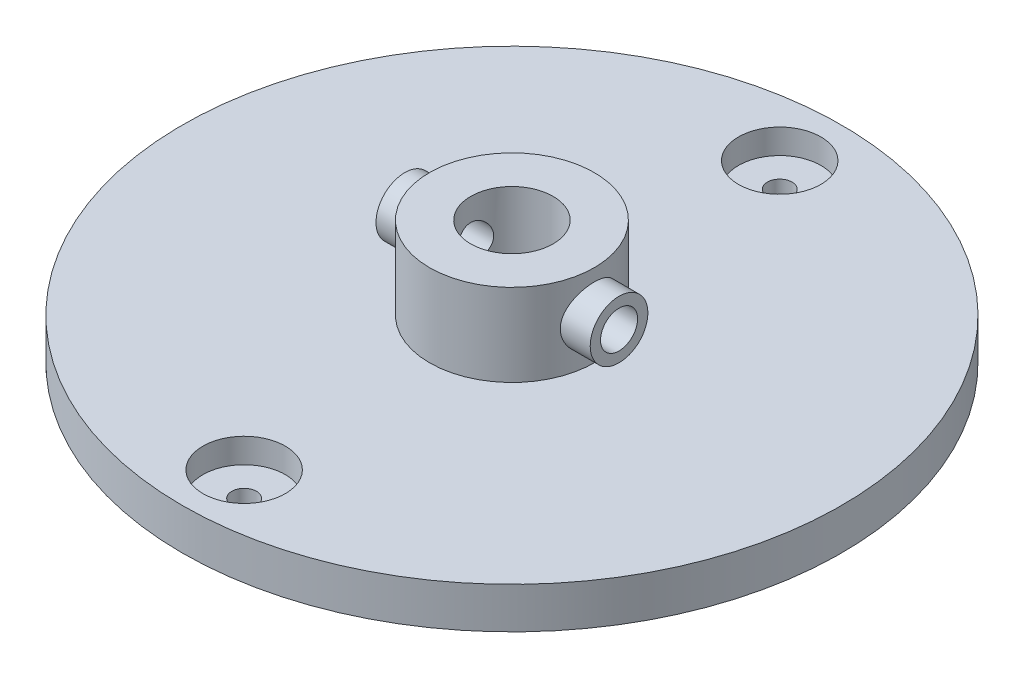
ISO-10303-21;
HEADER;
FILE_DESCRIPTION(('STEP AP214'),'2;1');
FILE_NAME('part.step','',(''),(''),'','','');
FILE_SCHEMA(('AUTOMOTIVE_DESIGN { 1 0 10303 214 1 1 1 1 }'));
ENDSEC;
DATA;
#1=APPLICATION_CONTEXT('core data for automotive mechanical design processes');
#2=APPLICATION_PROTOCOL_DEFINITION('international standard','automotive_design',2000,#1);
#3=PRODUCT_CONTEXT('',#1,'mechanical');
#4=PRODUCT('Part','Part','',(#3));
#5=PRODUCT_RELATED_PRODUCT_CATEGORY('part','',(#4));
#6=PRODUCT_DEFINITION_FORMATION('','',#4);
#7=PRODUCT_DEFINITION_CONTEXT('part definition',#1,'design');
#8=PRODUCT_DEFINITION('design','',#6,#7);
#9=PRODUCT_DEFINITION_SHAPE('','',#8);
#10=(LENGTH_UNIT() NAMED_UNIT(*) SI_UNIT(.MILLI.,.METRE.));
#11=(NAMED_UNIT(*) PLANE_ANGLE_UNIT() SI_UNIT($,.RADIAN.));
#12=(NAMED_UNIT(*) SI_UNIT($,.STERADIAN.) SOLID_ANGLE_UNIT());
#13=UNCERTAINTY_MEASURE_WITH_UNIT(LENGTH_MEASURE(1.E-05),#10,'distance_accuracy_value','');
#14=(GEOMETRIC_REPRESENTATION_CONTEXT(3) GLOBAL_UNCERTAINTY_ASSIGNED_CONTEXT((#13)) GLOBAL_UNIT_ASSIGNED_CONTEXT((#10,
#11,#12)) REPRESENTATION_CONTEXT('',''));
#15=CARTESIAN_POINT('',(0.,0.,0.));
#16=DIRECTION('',(0.,0.,1.));
#17=DIRECTION('',(1.,0.,0.));
#18=AXIS2_PLACEMENT_3D('',#15,#16,#17);
#19=CARTESIAN_POINT('',(4.14762753306674,15.,5.46076691114872));
#20=DIRECTION('',(0.,-1.,0.));
#21=DIRECTION('',(0.,0.,-1.));
#22=AXIS2_PLACEMENT_3D('',#19,#20,#21);
#23=CYLINDRICAL_SURFACE('',#22,10.);
#24=CARTESIAN_POINT('',(-5.21986946453087,9.99999999999999,1.96076691114871));
#25=CARTESIAN_POINT('',(-5.21986687665246,10.1900152284432,1.9607638546146));
#26=CARTESIAN_POINT('',(-5.22571408078831,10.3800091662818,1.97629285423085));
#27=CARTESIAN_POINT('',(-5.24833354619784,10.754329226878,2.03776122428684));
#28=CARTESIAN_POINT('',(-5.26510671521073,10.9386548773765,2.0837031214632));
#29=CARTESIAN_POINT('',(-5.30745044309769,11.2961466836094,2.20415434011447));
#30=CARTESIAN_POINT('',(-5.33300229725591,11.4693356443051,2.27860296071652));
#31=CARTESIAN_POINT('',(-5.38999603122424,11.8008267674047,2.4537436926653));
#32=CARTESIAN_POINT('',(-5.42143940799503,11.9591251309098,2.55444247639322));
#33=CARTESIAN_POINT('',(-5.48819589185516,12.2631786167826,2.78388397149806));
#34=CARTESIAN_POINT('',(-5.52361242878601,12.4081978438373,2.91357203596137));
#35=CARTESIAN_POINT('',(-5.593455005276,12.6749374940333,3.19529774863712));
#36=CARTESIAN_POINT('',(-5.62788086578551,12.7966537277083,3.34733940696044));
#37=CARTESIAN_POINT('',(-5.69307302407926,13.0167501289199,3.67491672509639));
#38=CARTESIAN_POINT('',(-5.72370366593817,13.1143480900762,3.85100733707501));
#39=CARTESIAN_POINT('',(-5.77662606937584,13.2782396177485,4.21836547693517));
#40=CARTESIAN_POINT('',(-5.79892032443189,13.3445425464079,4.40962844586724));
#41=CARTESIAN_POINT('',(-5.83192481088995,13.4414335774764,4.79417802889245));
#42=CARTESIAN_POINT('',(-5.84304357203917,13.4732847450521,4.98711067304786));
#43=CARTESIAN_POINT('',(-5.85390061643987,13.5043961753192,5.37588130900486));
#44=CARTESIAN_POINT('',(-5.85364212746184,13.5036656815551,5.57171846102468));
#45=CARTESIAN_POINT('',(-5.84204411383341,13.4704103836545,5.9517554525186));
#46=CARTESIAN_POINT('',(-5.83118360247201,13.4392599696618,6.1360926255396));
#47=CARTESIAN_POINT('',(-5.80021364050776,13.3483369720774,6.49673537307453));
#48=CARTESIAN_POINT('',(-5.78010354893129,13.288562404889,6.67304039004868));
#49=CARTESIAN_POINT('',(-5.73231116387176,13.1413506967889,7.01548174296641));
#50=CARTESIAN_POINT('',(-5.7045283527223,13.0535437479981,7.1814444946287));
#51=CARTESIAN_POINT('',(-5.64425170797549,12.853072546675,7.496668085162));
#52=CARTESIAN_POINT('',(-5.61175647605714,12.7404009108251,7.6459239432066));
#53=CARTESIAN_POINT('',(-5.54347369962726,12.486587853106,7.93164683021429));
#54=CARTESIAN_POINT('',(-5.50760279022323,12.3442779649731,8.06705752288942));
#55=CARTESIAN_POINT('',(-5.43799609904677,12.0386960162178,8.31245569500653));
#56=CARTESIAN_POINT('',(-5.40426072121509,11.8754200073885,8.42243837505396));
#57=CARTESIAN_POINT('',(-5.34226069951454,11.5288799309362,8.6155284432016));
#58=CARTESIAN_POINT('',(-5.31409966938872,11.3453213771916,8.6981431805713));
#59=CARTESIAN_POINT('',(-5.26763201015099,10.9656586516986,8.83091448548673));
#60=CARTESIAN_POINT('',(-5.24932073796607,10.7695604398775,8.88108634852309));
#61=CARTESIAN_POINT('',(-5.22569352663041,10.3807032503863,8.94530021736018));
#62=CARTESIAN_POINT('',(-5.21978328859801,10.188253602383,8.96099628383413));
#63=CARTESIAN_POINT('',(-5.21995749005509,9.8034208395003,8.96053258790133));
#64=CARTESIAN_POINT('',(-5.22603945405916,9.61103771908709,8.94437939996394));
#65=CARTESIAN_POINT('',(-5.24891582224021,9.23968188163594,8.88216775068631));
#66=CARTESIAN_POINT('',(-5.26528073475515,9.06047913307321,8.83730700562205));
#67=CARTESIAN_POINT('',(-5.3063921933865,8.71219693104326,8.72041759834967));
#68=CARTESIAN_POINT('',(-5.33114031837163,8.54311939159119,8.64838381816424));
#69=CARTESIAN_POINT('',(-5.38727198369573,8.21349055582935,8.47641206598258));
#70=CARTESIAN_POINT('',(-5.41885298032786,8.05342647162964,8.37560648065644));
#71=CARTESIAN_POINT('',(-5.4847293365715,7.75189155143616,8.14991191747914));
#72=CARTESIAN_POINT('',(-5.51902557163154,7.61042675166998,8.02501515334125));
#73=CARTESIAN_POINT('',(-5.58870365719288,7.34221271457581,7.74669938563421));
#74=CARTESIAN_POINT('',(-5.62404436923233,7.21666780735564,7.59210579607881));
#75=CARTESIAN_POINT('',(-5.69002619521553,6.99319819734154,7.26317284727119));
#76=CARTESIAN_POINT('',(-5.7206674183363,6.89527285285453,7.08883394689926));
#77=CARTESIAN_POINT('',(-5.77369382929774,6.73064573911158,6.72598307458043));
#78=CARTESIAN_POINT('',(-5.79612478880901,6.66377028967395,6.5375569565149));
#79=CARTESIAN_POINT('',(-5.83039183520593,6.56297441903225,6.15118166121807));
#80=CARTESIAN_POINT('',(-5.84223218608898,6.52904073432456,5.95323635046693));
#81=CARTESIAN_POINT('',(-5.85362976427073,6.49637958739644,5.56440379490104));
#82=CARTESIAN_POINT('',(-5.85378751777275,6.49593087152782,5.373677276388));
#83=CARTESIAN_POINT('',(-5.84331447113532,6.52593609624751,4.99499183721998));
#84=CARTESIAN_POINT('',(-5.83268470234666,6.55638708264191,4.80703265373424));
#85=CARTESIAN_POINT('',(-5.80207369861303,6.64615469186611,4.44280327173886));
#86=CARTESIAN_POINT('',(-5.78227394474207,6.70491197983297,4.26637885168844));
#87=CARTESIAN_POINT('',(-5.73536718200365,6.84909270984445,3.92584288400897));
#88=CARTESIAN_POINT('',(-5.70825881475543,6.93452110945554,3.76173363253587));
#89=CARTESIAN_POINT('',(-5.64817568389101,7.13345438296181,3.44346632482008));
#90=CARTESIAN_POINT('',(-5.61501273601348,7.24792788099003,3.28994978441793));
#91=CARTESIAN_POINT('',(-5.54694636514274,7.50010266562639,3.00375335006897));
#92=CARTESIAN_POINT('',(-5.51204236166445,7.63781173615961,2.87108046761279));
#93=CARTESIAN_POINT('',(-5.44256368283997,7.93983709021465,2.62432394062248));
#94=CARTESIAN_POINT('',(-5.40807229654529,8.1050626660869,2.51132595086188));
#95=CARTESIAN_POINT('',(-5.34516936083942,8.45324771431642,2.31473639116619));
#96=CARTESIAN_POINT('',(-5.31675702476101,8.63620488763618,2.23114101544587));
#97=CARTESIAN_POINT('',(-5.2699145074793,9.01280429693809,2.0969985700102));
#98=CARTESIAN_POINT('',(-5.2513771772574,9.20630562654927,2.04609547161435));
#99=CARTESIAN_POINT('',(-5.22635872503917,9.59988116532614,1.97798881784396));
#100=CARTESIAN_POINT('',(-5.21987218904363,9.79995238173779,1.96077012906117));
#101=CARTESIAN_POINT('',(-5.21986946453087,9.99999999999999,1.96076691114871));
#102=B_SPLINE_CURVE_WITH_KNOTS('',3,(#24,#25,#26,#27,#28,#29,#30,#31,#32,#33,#34,#35,#36,#37,
#38,#39,#40,#41,#42,#43,#44,#45,#46,#47,#48,#49,#50,#51,#52,#53,#54,#55,#56,#57,#58,#59,#60,#61,
#62,#63,#64,#65,#66,#67,#68,#69,#70,#71,#72,#73,#74,#75,#76,#77,#78,#79,#80,#81,#82,#83,#84,#85,
#86,#87,#88,#89,#90,#91,#92,#93,#94,#95,#96,#97,#98,#99,#100,#101),.UNSPECIFIED.,.T.,.F.,(4,2,2,
2,2,2,2,2,2,2,2,2,2,2,2,2,2,2,2,2,2,2,2,2,2,2,2,2,2,2,2,2,2,2,2,2,2,2,4),(0.,0.569303271188397,
1.1386538466494,1.7067987558077,2.27508821957678,2.86567632067937,3.45637049958397,
4.06425497293885,4.671957477662,5.25653473089017,5.84094613832784,6.4001199130392,
6.95933244298444,7.52625023609969,8.09333659677847,8.68966509904168,9.28610606324157,
9.89276413906806,10.499135991446,11.0757147838072,11.6521745685868,12.2060258875446,
12.7599815752237,13.3328233448281,13.9058505684788,14.5097673315547,15.1136700625062,
15.7141528622371,16.3143937862434,16.8837576246019,17.4530670335451,18.0115615554683,
18.5701599509704,19.1506370908609,19.7313090782975,20.3377389331388,20.9440902646265,
21.5437209656749,22.1430822084723),.UNSPECIFIED.);
#103=CARTESIAN_POINT('',(-5.21986946453087,9.99999999999999,1.96076691114871));
#104=VERTEX_POINT('',#103);
#105=EDGE_CURVE('E145',#104,#104,#102,.T.);
#106=ORIENTED_EDGE('',*,*,#105,.T.);
#107=EDGE_LOOP('',(#106));
#108=FACE_BOUND('',#107,.T.);
#109=CARTESIAN_POINT('',(4.14762753306673,5.,5.46076691114872));
#110=DIRECTION('',(0.,1.,0.));
#111=DIRECTION('',(0.,0.,1.));
#112=AXIS2_PLACEMENT_3D('',#109,#110,#111);
#113=CIRCLE('',#112,10.);
#114=CARTESIAN_POINT('',(4.14762753306673,5.,15.4607669111487));
#115=VERTEX_POINT('',#114);
#116=EDGE_CURVE('E98',#115,#115,#113,.T.);
#117=ORIENTED_EDGE('',*,*,#116,.T.);
#118=EDGE_LOOP('',(#117));
#119=FACE_BOUND('',#118,.T.);
#120=CARTESIAN_POINT('',(4.14762753306674,15.,5.46076691114872));
#121=DIRECTION('',(0.,1.,0.));
#122=DIRECTION('',(0.,0.,1.));
#123=AXIS2_PLACEMENT_3D('',#120,#121,#122);
#124=CIRCLE('',#123,10.);
#125=CARTESIAN_POINT('',(4.14762753306674,15.,15.4607669111487));
#126=VERTEX_POINT('',#125);
#127=EDGE_CURVE('E95',#126,#126,#124,.T.);
#128=ORIENTED_EDGE('',*,*,#127,.F.);
#129=EDGE_LOOP('',(#128));
#130=FACE_BOUND('',#129,.T.);
#131=CARTESIAN_POINT('',(13.5151245306643,9.99999999999999,8.96076691114871));
#132=CARTESIAN_POINT('',(13.5151219427859,9.80998477155683,8.96076996768283));
#133=CARTESIAN_POINT('',(13.5209691469218,9.61999083371819,8.94524096806651));
#134=CARTESIAN_POINT('',(13.5435886123314,9.24567077312197,8.88377259801048));
#135=CARTESIAN_POINT('',(13.5603617813442,9.06134512262348,8.83783070083414));
#136=CARTESIAN_POINT('',(13.6027055092311,8.70385331639056,8.71737948218289));
#137=CARTESIAN_POINT('',(13.6282573633894,8.53066435569495,8.64293086158082));
#138=CARTESIAN_POINT('',(13.6852510973577,8.1991732325953,8.46779012963206));
#139=CARTESIAN_POINT('',(13.7166944741285,8.04087486909023,8.36709134590415));
#140=CARTESIAN_POINT('',(13.7834509579886,7.73682138321736,8.13764985079932));
#141=CARTESIAN_POINT('',(13.8188674949195,7.59180215616272,8.00796178633599));
#142=CARTESIAN_POINT('',(13.8887100714095,7.32506250596673,7.72623607366023));
#143=CARTESIAN_POINT('',(13.923135931919,7.20334627229171,7.57419441533691));
#144=CARTESIAN_POINT('',(13.9883280902127,6.98324987108005,7.24661709720097));
#145=CARTESIAN_POINT('',(14.0189587320717,6.88565190992379,7.07052648522235));
#146=CARTESIAN_POINT('',(14.0718811355093,6.72176038225146,6.70316834536218));
#147=CARTESIAN_POINT('',(14.0941753905653,6.65545745359213,6.51190537643011));
#148=CARTESIAN_POINT('',(14.1271798770234,6.55856642252359,6.1273557934049));
#149=CARTESIAN_POINT('',(14.1382986381726,6.52671525494792,5.93442314924949));
#150=CARTESIAN_POINT('',(14.1491556825733,6.49560382468076,5.5456525132925));
#151=CARTESIAN_POINT('',(14.1488971935953,6.49633431844493,5.34981536127268));
#152=CARTESIAN_POINT('',(14.1372991799668,6.52958961634551,4.96977836977875));
#153=CARTESIAN_POINT('',(14.1264386686055,6.56074003033821,4.78544119675776));
#154=CARTESIAN_POINT('',(14.0954687066412,6.65166302792263,4.42479844922285));
#155=CARTESIAN_POINT('',(14.0753586150647,6.71143759511096,4.24849343224871));
#156=CARTESIAN_POINT('',(14.0275662300052,6.85864930321107,3.90605207933097));
#157=CARTESIAN_POINT('',(13.9997834188558,6.94645625200186,3.74008932766867));
#158=CARTESIAN_POINT('',(13.9395067741089,7.14692745332499,3.42486573713538));
#159=CARTESIAN_POINT('',(13.9070115421906,7.25959908917485,3.2756098790908));
#160=CARTESIAN_POINT('',(13.8387287657607,7.51341214689405,2.9898869920831));
#161=CARTESIAN_POINT('',(13.8028578563567,7.65572203502689,2.85447629940793));
#162=CARTESIAN_POINT('',(13.7332511651802,7.9613039837822,2.6090781272908));
#163=CARTESIAN_POINT('',(13.6995157873485,8.12457999261145,2.49909544724338));
#164=CARTESIAN_POINT('',(13.637515765648,8.47112006906378,2.30600537909574));
#165=CARTESIAN_POINT('',(13.6093547355222,8.65467862280837,2.22339064172603));
#166=CARTESIAN_POINT('',(13.5628870762844,9.03434134830137,2.09061933681062));
#167=CARTESIAN_POINT('',(13.5445758040995,9.23043956012249,2.04044747377431));
#168=CARTESIAN_POINT('',(13.5209485927639,9.61929674961367,1.97623360493721));
#169=CARTESIAN_POINT('',(13.5150383547314,9.81174639761701,1.96053753846322));
#170=CARTESIAN_POINT('',(13.5152125561885,10.1965791604997,1.961001234396));
#171=CARTESIAN_POINT('',(13.5212945201926,10.3889622809129,1.97715442233342));
#172=CARTESIAN_POINT('',(13.5441708883737,10.7603181183641,2.03936607161104));
#173=CARTESIAN_POINT('',(13.5605358008886,10.9395208669268,2.08422681667528));
#174=CARTESIAN_POINT('',(13.6016472595199,11.2878030689568,2.20111622394769));
#175=CARTESIAN_POINT('',(13.6263953845051,11.4568806084088,2.27315000413316));
#176=CARTESIAN_POINT('',(13.6825270498292,11.7865094441707,2.44512175631483));
#177=CARTESIAN_POINT('',(13.7141080464613,11.9465735283704,2.54592734164093));
#178=CARTESIAN_POINT('',(13.7799844027049,12.2481084485639,2.77162190481821));
#179=CARTESIAN_POINT('',(13.814280637765,12.38957324833,2.8965186689561));
#180=CARTESIAN_POINT('',(13.8839587233263,12.6577872854242,3.17483443666315));
#181=CARTESIAN_POINT('',(13.9192994353658,12.7833321926444,3.32942802621855));
#182=CARTESIAN_POINT('',(13.985281261349,13.0068018026585,3.6583609750262));
#183=CARTESIAN_POINT('',(14.0159224844697,13.1047271471455,3.83269987539816));
#184=CARTESIAN_POINT('',(14.0689488954312,13.2693542608884,4.195550747717));
#185=CARTESIAN_POINT('',(14.0913798549425,13.336229710326,4.38397686578251));
#186=CARTESIAN_POINT('',(14.1256469013394,13.4370255809678,4.7703521610793));
#187=CARTESIAN_POINT('',(14.1374872522224,13.4709592656754,4.96829747183044));
#188=CARTESIAN_POINT('',(14.1488848304042,13.5036204126036,5.35713002739632));
#189=CARTESIAN_POINT('',(14.1490425839062,13.5040691284722,5.54785654590935));
#190=CARTESIAN_POINT('',(14.1385695372688,13.4740639037525,5.92654198507737));
#191=CARTESIAN_POINT('',(14.1279397684801,13.4436129173581,6.11450116856312));
#192=CARTESIAN_POINT('',(14.0973287647465,13.3538453081339,6.47873055055851));
#193=CARTESIAN_POINT('',(14.0775290108756,13.295088020167,6.65515497060893));
#194=CARTESIAN_POINT('',(14.0306222481371,13.1509072901555,6.99569093828844));
#195=CARTESIAN_POINT('',(14.0035138808889,13.0654788905445,7.15980018976157));
#196=CARTESIAN_POINT('',(13.9434307500245,12.8665456170382,7.47806749747735));
#197=CARTESIAN_POINT('',(13.910267802147,12.7520721190099,7.63158403787946));
#198=CARTESIAN_POINT('',(13.8422014312762,12.4998973343735,7.91778047222843));
#199=CARTESIAN_POINT('',(13.8072974277979,12.3621882638404,8.05045335468465));
#200=CARTESIAN_POINT('',(13.7378187489734,12.0601629097853,8.29720988167493));
#201=CARTESIAN_POINT('',(13.7033273626788,11.894937333913,8.41020787143548));
#202=CARTESIAN_POINT('',(13.6404244269729,11.5467522856835,8.60679743113118));
#203=CARTESIAN_POINT('',(13.6120120908945,11.3637951123638,8.69039280685158));
#204=CARTESIAN_POINT('',(13.5651695736128,10.9871957030619,8.82453525228723));
#205=CARTESIAN_POINT('',(13.5466322433909,10.7936943734507,8.87543835068299));
#206=CARTESIAN_POINT('',(13.5216137911727,10.4001188346738,8.94354500445338));
#207=CARTESIAN_POINT('',(13.515127255177,10.2000476182622,8.96076369323625));
#208=CARTESIAN_POINT('',(13.5151245306643,9.99999999999999,8.96076691114871));
#209=B_SPLINE_CURVE_WITH_KNOTS('',3,(#131,#132,#133,#134,#135,#136,#137,#138,#139,#140,#141,
#142,#143,#144,#145,#146,#147,#148,#149,#150,#151,#152,#153,#154,#155,#156,#157,#158,#159,#160,
#161,#162,#163,#164,#165,#166,#167,#168,#169,#170,#171,#172,#173,#174,#175,#176,#177,#178,#179,
#180,#181,#182,#183,#184,#185,#186,#187,#188,#189,#190,#191,#192,#193,#194,#195,#196,#197,#198,
#199,#200,#201,#202,#203,#204,#205,#206,#207,#208),.UNSPECIFIED.,.T.,.F.,(4,2,2,2,2,2,2,2,2,2,2,
2,2,2,2,2,2,2,2,2,2,2,2,2,2,2,2,2,2,2,2,2,2,2,2,2,2,2,4),(0.,0.569303271188395,1.1386538466494,
1.70679875580769,2.27508821957676,2.86567632067936,3.45637049958397,4.06425497293885,
4.67195747766199,5.25653473089016,5.84094613832784,6.40011991303918,6.9593324429844,
7.52625023609965,8.09333659677845,8.68966509904168,9.28610606324158,9.89276413906806,
10.499135991446,11.0757147838072,11.6521745685869,12.2060258875446,12.7599815752237,
13.3328233448281,13.9058505684788,14.5097673315547,15.1136700625063,15.7141528622371,
16.3143937862434,16.8837576246019,17.453067033545,18.0115615554684,18.5701599509704,
19.150637090861,19.7313090782975,20.3377389331389,20.9440902646265,21.5437209656749,
22.1430822084723),.UNSPECIFIED.);
#210=CARTESIAN_POINT('',(13.5151245306643,9.99999999999999,8.96076691114871));
#211=VERTEX_POINT('',#210);
#212=EDGE_CURVE('E12',#211,#211,#209,.T.);
#213=ORIENTED_EDGE('',*,*,#212,.F.);
#214=EDGE_LOOP('',(#213));
#215=FACE_BOUND('',#214,.T.);
#216=ADVANCED_FACE('F42',(#108,#119,#130,#215),#23,.T.);
#217=CARTESIAN_POINT('',(4.14762753306673,5.,5.46076691114872));
#218=DIRECTION('',(0.,1.,0.));
#219=DIRECTION('',(0.,0.,1.));
#220=AXIS2_PLACEMENT_3D('',#217,#218,#219);
#221=PLANE('',#220);
#222=CARTESIAN_POINT('',(4.14762753306673,5.,5.46076691114872));
#223=DIRECTION('',(0.,1.,0.));
#224=DIRECTION('',(0.,0.,1.));
#225=AXIS2_PLACEMENT_3D('',#222,#223,#224);
#226=CIRCLE('',#225,40.);
#227=CARTESIAN_POINT('',(4.14762753306673,5.,45.4607669111487));
#228=VERTEX_POINT('',#227);
#229=EDGE_CURVE('E54',#228,#228,#226,.T.);
#230=ORIENTED_EDGE('',*,*,#229,.T.);
#231=EDGE_LOOP('',(#230));
#232=FACE_BOUND('',#231,.T.);
#233=CARTESIAN_POINT('',(4.14762753306672,4.99999999999996,37.9607669111487));
#234=DIRECTION('',(0.,1.,0.));
#235=DIRECTION('',(0.,0.,1.));
#236=AXIS2_PLACEMENT_3D('',#233,#234,#235);
#237=CIRCLE('',#236,5.);
#238=CARTESIAN_POINT('',(4.14762753306672,4.99999999999996,42.9607669111487));
#239=VERTEX_POINT('',#238);
#240=EDGE_CURVE('E66',#239,#239,#237,.T.);
#241=ORIENTED_EDGE('',*,*,#240,.F.);
#242=EDGE_LOOP('',(#241));
#243=FACE_BOUND('',#242,.T.);
#244=CARTESIAN_POINT('',(4.14762753306673,4.99999999999999,-27.0392330888513));
#245=DIRECTION('',(0.,1.,0.));
#246=DIRECTION('',(0.,0.,1.));
#247=AXIS2_PLACEMENT_3D('',#244,#245,#246);
#248=CIRCLE('',#247,5.);
#249=CARTESIAN_POINT('',(4.14762753306673,4.99999999999999,-22.0392330888513));
#250=VERTEX_POINT('',#249);
#251=EDGE_CURVE('E84',#250,#250,#248,.T.);
#252=ORIENTED_EDGE('',*,*,#251,.F.);
#253=EDGE_LOOP('',(#252));
#254=FACE_BOUND('',#253,.T.);
#255=ORIENTED_EDGE('',*,*,#116,.F.);
#256=EDGE_LOOP('',(#255));
#257=FACE_BOUND('',#256,.T.);
#258=ADVANCED_FACE('F140',(#232,#243,#254,#257),#221,.T.);
#259=CARTESIAN_POINT('',(4.14762753306673,5.,5.46076691114872));
#260=DIRECTION('',(0.,-1.,0.));
#261=DIRECTION('',(0.,0.,-1.));
#262=AXIS2_PLACEMENT_3D('',#259,#260,#261);
#263=CYLINDRICAL_SURFACE('',#262,40.);
#264=ORIENTED_EDGE('',*,*,#229,.F.);
#265=EDGE_LOOP('',(#264));
#266=FACE_BOUND('',#265,.T.);
#267=CARTESIAN_POINT('',(4.14762753306673,0.,5.46076691114872));
#268=DIRECTION('',(0.,1.,0.));
#269=DIRECTION('',(0.,0.,1.));
#270=AXIS2_PLACEMENT_3D('',#267,#268,#269);
#271=CIRCLE('',#270,40.);
#272=CARTESIAN_POINT('',(4.14762753306673,0.,45.4607669111487));
#273=VERTEX_POINT('',#272);
#274=EDGE_CURVE('E58',#273,#273,#271,.T.);
#275=ORIENTED_EDGE('',*,*,#274,.T.);
#276=EDGE_LOOP('',(#275));
#277=FACE_BOUND('',#276,.T.);
#278=ADVANCED_FACE('F44',(#266,#277),#263,.T.);
#279=CARTESIAN_POINT('',(4.14762753306673,0.,5.46076691114872));
#280=DIRECTION('',(0.,1.,0.));
#281=DIRECTION('',(0.,0.,1.));
#282=AXIS2_PLACEMENT_3D('',#279,#280,#281);
#283=PLANE('',#282);
#284=CARTESIAN_POINT('',(4.14762753306672,0.,37.9607669111487));
#285=DIRECTION('',(0.,1.,0.));
#286=DIRECTION('',(0.,0.,1.));
#287=AXIS2_PLACEMENT_3D('',#284,#285,#286);
#288=CIRCLE('',#287,1.5);
#289=CARTESIAN_POINT('',(4.14762753306672,0.,39.4607669111487));
#290=VERTEX_POINT('',#289);
#291=EDGE_CURVE('E74',#290,#290,#288,.T.);
#292=ORIENTED_EDGE('',*,*,#291,.T.);
#293=EDGE_LOOP('',(#292));
#294=FACE_BOUND('',#293,.T.);
#295=CARTESIAN_POINT('',(4.14762753306673,0.,-27.0392330888513));
#296=DIRECTION('',(0.,1.,0.));
#297=DIRECTION('',(0.,0.,1.));
#298=AXIS2_PLACEMENT_3D('',#295,#296,#297);
#299=CIRCLE('',#298,1.5);
#300=CARTESIAN_POINT('',(4.14762753306673,0.,-25.5392330888513));
#301=VERTEX_POINT('',#300);
#302=EDGE_CURVE('E72',#301,#301,#299,.T.);
#303=ORIENTED_EDGE('',*,*,#302,.T.);
#304=EDGE_LOOP('',(#303));
#305=FACE_BOUND('',#304,.T.);
#306=CARTESIAN_POINT('',(4.14762753306673,0.,5.46076691114872));
#307=DIRECTION('',(0.,1.,0.));
#308=DIRECTION('',(0.,0.,1.));
#309=AXIS2_PLACEMENT_3D('',#306,#307,#308);
#310=CIRCLE('',#309,5.);
#311=CARTESIAN_POINT('',(4.14762753306673,0.,10.4607669111487));
#312=VERTEX_POINT('',#311);
#313=EDGE_CURVE('E63',#312,#312,#310,.T.);
#314=ORIENTED_EDGE('',*,*,#313,.T.);
#315=EDGE_LOOP('',(#314));
#316=FACE_BOUND('',#315,.T.);
#317=ORIENTED_EDGE('',*,*,#274,.F.);
#318=EDGE_LOOP('',(#317));
#319=FACE_BOUND('',#318,.T.);
#320=ADVANCED_FACE('F232',(#294,#305,#316,#319),#283,.F.);
#321=CARTESIAN_POINT('',(4.14762753306673,-9.99999999999999,5.46076691114872));
#322=DIRECTION('',(0.,1.,0.));
#323=DIRECTION('',(0.,0.,1.));
#324=AXIS2_PLACEMENT_3D('',#321,#322,#323);
#325=CYLINDRICAL_SURFACE('',#324,5.);
#326=CARTESIAN_POINT('',(-0.317515241806197,9.99999999999999,3.21076691114867));
#327=CARTESIAN_POINT('',(-0.317522865660699,9.88103878726909,3.21077387083285));
#328=CARTESIAN_POINT('',(-0.322339139623045,9.76188521973887,3.22026246780204));
#329=CARTESIAN_POINT('',(-0.340951380169179,9.52710182849731,3.25779739089147));
#330=CARTESIAN_POINT('',(-0.354769757768139,9.41148155512273,3.28589003525869));
#331=CARTESIAN_POINT('',(-0.389478321520822,9.18758402854417,3.35926879620573));
#332=CARTESIAN_POINT('',(-0.410336363861018,9.07927603728497,3.40447687424152));
#333=CARTESIAN_POINT('',(-0.456725501509349,8.87180924501799,3.51056865073081));
#334=CARTESIAN_POINT('',(-0.482256026983975,8.77264933057045,3.57145043806211));
#335=CARTESIAN_POINT('',(-0.537189340807168,8.57901523100731,3.71190008666761));
#336=CARTESIAN_POINT('',(-0.56673656646559,8.4852850632113,3.79243771348056));
#337=CARTESIAN_POINT('',(-0.625196386475297,8.31210092364605,3.96788376408983));
#338=CARTESIAN_POINT('',(-0.654108706668724,8.23265301666167,4.0627982614718));
#339=CARTESIAN_POINT('',(-0.709847269085093,8.08626420055377,4.27036350876758));
#340=CARTESIAN_POINT('',(-0.736486423907011,8.02019024568508,4.38368056182029));
#341=CARTESIAN_POINT('',(-0.78286991861745,7.90837301902492,4.62124090137606));
#342=CARTESIAN_POINT('',(-0.802617802938858,7.86261929248347,4.7454785297393));
#343=CARTESIAN_POINT('',(-0.831963635140884,7.79553127180543,4.99351327903221));
#344=CARTESIAN_POINT('',(-0.842095672186278,7.77290580549812,5.11689663003197));
#345=CARTESIAN_POINT('',(-0.853028689759171,7.74851393865545,5.36609539351867));
#346=CARTESIAN_POINT('',(-0.853834133382542,7.74673756110819,5.49190961387586));
#347=CARTESIAN_POINT('',(-0.846314885155746,7.76348461495979,5.73289184174646));
#348=CARTESIAN_POINT('',(-0.838632312930701,7.78058029473292,5.84818314364124));
#349=CARTESIAN_POINT('',(-0.815916142705109,7.83209818518492,6.07405537038778));
#350=CARTESIAN_POINT('',(-0.800881999910286,7.86652167996155,6.18463594548687));
#351=CARTESIAN_POINT('',(-0.764598607280982,7.95207805057587,6.39999590654976));
#352=CARTESIAN_POINT('',(-0.74325842353476,8.00345678653465,6.50466166490885));
#353=CARTESIAN_POINT('',(-0.69638834550873,8.12119629512818,6.70416013040565));
#354=CARTESIAN_POINT('',(-0.670856920245742,8.1875625457658,6.79898922365792));
#355=CARTESIAN_POINT('',(-0.615687281013063,8.33955583572039,6.98421866408173));
#356=CARTESIAN_POINT('',(-0.585883921602666,8.42630082335005,7.07365364547142));
#357=CARTESIAN_POINT('',(-0.526981757684844,8.61350730053294,7.23716683723616));
#358=CARTESIAN_POINT('',(-0.497883328090572,8.71397590821017,7.31123702770389));
#359=CARTESIAN_POINT('',(-0.442391385174561,8.93123567552833,7.44500672132622));
#360=CARTESIAN_POINT('',(-0.416171069426282,9.04854743700397,7.50393906357836));
#361=CARTESIAN_POINT('',(-0.371566208909249,9.29291404709419,7.60080525396057));
#362=CARTESIAN_POINT('',(-0.35317500006659,9.41996050046905,7.63875696888626));
#363=CARTESIAN_POINT('',(-0.328049527107084,9.67049373882173,7.68990939747259));
#364=CARTESIAN_POINT('',(-0.320573245221355,9.79358138063129,7.70469128361628));
#365=CARTESIAN_POINT('',(-0.315995102332712,10.0406793100698,7.71378933584901));
#366=CARTESIAN_POINT('',(-0.318888525254438,10.1646891526861,7.70811480537846));
#367=CARTESIAN_POINT('',(-0.333947557118244,10.3996001648764,7.67790907278436));
#368=CARTESIAN_POINT('',(-0.345352071237147,10.5107558097788,7.65492434970488));
#369=CARTESIAN_POINT('',(-0.375116715966322,10.7274996545956,7.59289233534234));
#370=CARTESIAN_POINT('',(-0.393478665536359,10.8330863903371,7.55384084331574));
#371=CARTESIAN_POINT('',(-0.436087280109704,11.0410481707792,7.45885975698297));
#372=CARTESIAN_POINT('',(-0.460562076654559,11.1430633649458,7.40224814102473));
#373=CARTESIAN_POINT('',(-0.512362023743072,11.3366836138208,7.27439619003964));
#374=CARTESIAN_POINT('',(-0.53968853069952,11.4282836708995,7.20314887781378));
#375=CARTESIAN_POINT('',(-0.59733581148181,11.6078255379359,7.03985568536393));
#376=CARTESIAN_POINT('',(-0.627687883462617,11.694531895157,6.94645668618456));
#377=CARTESIAN_POINT('',(-0.685548715040578,11.851326543911,6.74579688551593));
#378=CARTESIAN_POINT('',(-0.713057027150152,11.9214122222902,6.6385339083803));
#379=CARTESIAN_POINT('',(-0.76254789590405,12.0433961414959,6.41144912023474));
#380=CARTESIAN_POINT('',(-0.784472687013298,12.0951062823748,6.29151286365458));
#381=CARTESIAN_POINT('',(-0.819888302677006,12.1771762488785,6.0433864505399));
#382=CARTESIAN_POINT('',(-0.833385072660567,12.2075511270571,5.91520218302089));
#383=CARTESIAN_POINT('',(-0.849638601914965,12.2439710415703,5.66516172493581));
#384=CARTESIAN_POINT('',(-0.853160148023726,12.2517498349332,5.54360651981305));
#385=CARTESIAN_POINT('',(-0.85128826497635,12.2475911911414,5.30091863144012));
#386=CARTESIAN_POINT('',(-0.845896902303057,12.2356583241909,5.17978585677326));
#387=CARTESIAN_POINT('',(-0.827235537244459,12.1936476316651,4.94721742269585));
#388=CARTESIAN_POINT('',(-0.814341875639193,12.1644355034439,4.83559245839317));
#389=CARTESIAN_POINT('',(-0.782210435687745,12.089721662337,4.61892166005327));
#390=CARTESIAN_POINT('',(-0.762971564546658,12.0442171434013,4.5138769630042));
#391=CARTESIAN_POINT('',(-0.718865356534318,11.9359251090506,4.30801520461351));
#392=CARTESIAN_POINT('',(-0.693780589750645,11.8724414763288,4.20761212357048));
#393=CARTESIAN_POINT('',(-0.640834077584305,11.7309445814172,4.01844234775528));
#394=CARTESIAN_POINT('',(-0.612971137381962,11.6529250550821,3.92968069798582));
#395=CARTESIAN_POINT('',(-0.554723415013156,11.477163647526,3.75879974443761));
#396=CARTESIAN_POINT('',(-0.524317023497115,11.3783366721409,3.67779926331711));
#397=CARTESIAN_POINT('',(-0.466572534191474,11.1677352006364,3.53327393482727));
#398=CARTESIAN_POINT('',(-0.439236415559887,11.0559524462233,3.46976032198892));
#399=CARTESIAN_POINT('',(-0.390941112064932,10.8211515361848,3.36197147934533));
#400=CARTESIAN_POINT('',(-0.370021513244126,10.69806949051,3.31781498149638));
#401=CARTESIAN_POINT('',(-0.345941455879895,10.5085450162448,3.26801526341153));
#402=CARTESIAN_POINT('',(-0.33913428044603,10.4446151097391,3.25415980845853));
#403=CARTESIAN_POINT('',(-0.3281941013066,10.3155836028458,3.23205013226548));
#404=CARTESIAN_POINT('',(-0.324059102180268,10.2504829141542,3.22379173125652));
#405=CARTESIAN_POINT('',(-0.320075873522722,10.1543423353983,3.2158542166696));
#406=CARTESIAN_POINT('',(-0.319117115894869,10.1235140886301,3.21394775450565));
#407=CARTESIAN_POINT('',(-0.317835799627561,10.0617948896694,3.21140317752989));
#408=CARTESIAN_POINT('',(-0.317513261268992,10.0309039355094,3.21076510315071));
#409=CARTESIAN_POINT('',(-0.317515241806197,9.99999999999999,3.21076691114867));
#410=B_SPLINE_CURVE_WITH_KNOTS('',3,(#326,#327,#328,#329,#330,#331,#332,#333,#334,#335,#336,
#337,#338,#339,#340,#341,#342,#343,#344,#345,#346,#347,#348,#349,#350,#351,#352,#353,#354,#355,
#356,#357,#358,#359,#360,#361,#362,#363,#364,#365,#366,#367,#368,#369,#370,#371,#372,#373,#374,
#375,#376,#377,#378,#379,#380,#381,#382,#383,#384,#385,#386,#387,#388,#389,#390,#391,#392,#393,
#394,#395,#396,#397,#398,#399,#400,#401,#402,#403,#404,#405,#406,#407,#408,#409),.UNSPECIFIED.,
.T.,.F.,(4,2,2,2,2,2,2,2,2,2,2,2,2,2,2,2,2,2,2,2,2,2,2,2,2,2,2,2,2,2,2,2,2,2,2,2,2,2,2,2,2,4),
(0.,0.356759742987553,0.714411062073151,1.07045091984825,1.42644738561853,1.80599601944599,
2.18570544513355,2.58519198578237,2.98447275197118,3.35999219707465,3.73533193577188,
4.08410830185018,4.43291051821018,4.78701075889261,5.14124063485555,5.52388400014617,
5.90672659268638,6.30625734447517,6.70544733553705,7.07598167335182,7.4463475159109,
7.78705357899948,8.12784877819471,8.48402022975505,8.84036187276862,9.23157909435328,
9.62285778358306,10.0180336177098,10.412930364732,10.7766046049827,11.1401945381678,
11.4869501554105,11.83376552337,12.1964652511595,12.5593216450042,12.9515422543472,
13.3440142630044,13.7388610212111,13.9359176589375,14.1328269760451,14.2255036426529,
14.318183263485),.UNSPECIFIED.);
#411=CARTESIAN_POINT('',(-0.317515241806197,9.99999999999999,3.21076691114867));
#412=VERTEX_POINT('',#411);
#413=EDGE_CURVE('E106',#412,#412,#410,.T.);
#414=ORIENTED_EDGE('',*,*,#413,.T.);
#415=EDGE_LOOP('',(#414));
#416=FACE_BOUND('',#415,.T.);
#417=CARTESIAN_POINT('',(8.61277030793964,9.99999999999999,3.21076691114867));
#418=CARTESIAN_POINT('',(8.61277793179413,10.1189612127309,3.21077387083285));
#419=CARTESIAN_POINT('',(8.61759420575651,10.2381147802611,3.22026246780205));
#420=CARTESIAN_POINT('',(8.63620644630264,10.4728981715027,3.25779739089146));
#421=CARTESIAN_POINT('',(8.65002482390156,10.5885184448773,3.28589003525868));
#422=CARTESIAN_POINT('',(8.68473338765424,10.8124159714558,3.35926879620571));
#423=CARTESIAN_POINT('',(8.70559142999446,10.920723962715,3.40447687424152));
#424=CARTESIAN_POINT('',(8.75198056764282,11.128190754982,3.51056865073081));
#425=CARTESIAN_POINT('',(8.77751109311744,11.2273506694295,3.5714504380621));
#426=CARTESIAN_POINT('',(8.83244440694064,11.4209847689927,3.71190008666759));
#427=CARTESIAN_POINT('',(8.86199163259906,11.5147149367887,3.79243771348055));
#428=CARTESIAN_POINT('',(8.92045145260875,11.6878990763539,3.96788376408984));
#429=CARTESIAN_POINT('',(8.94936377280215,11.7673469833383,4.06279826147181));
#430=CARTESIAN_POINT('',(9.00510233521852,11.9137357994462,4.27036350876759));
#431=CARTESIAN_POINT('',(9.03174149004048,11.9798097543149,4.3836805618203));
#432=CARTESIAN_POINT('',(9.07812498475091,12.0916269809751,4.62124090137608));
#433=CARTESIAN_POINT('',(9.09787286907226,12.1373807075165,4.74547852973933));
#434=CARTESIAN_POINT('',(9.12721870127429,12.2044687281946,4.99351327903224));
#435=CARTESIAN_POINT('',(9.13735073831973,12.2270941945019,5.11689663003199));
#436=CARTESIAN_POINT('',(9.14828375589264,12.2514860613445,5.36609539351867));
#437=CARTESIAN_POINT('',(9.149089199516,12.2532624388918,5.49190961387585));
#438=CARTESIAN_POINT('',(9.1415699512892,12.2365153850402,5.73289184174644));
#439=CARTESIAN_POINT('',(9.13388737906417,12.2194197052671,5.84818314364122));
#440=CARTESIAN_POINT('',(9.11117120883856,12.1679018148151,6.07405537038774));
#441=CARTESIAN_POINT('',(9.09613706604371,12.1334783200384,6.18463594548683));
#442=CARTESIAN_POINT('',(9.05985367341441,12.0479219494241,6.39999590654972));
#443=CARTESIAN_POINT('',(9.03851348966823,11.9965432134654,6.50466166490883));
#444=CARTESIAN_POINT('',(8.99164341164219,11.8788037048718,6.70416013040563));
#445=CARTESIAN_POINT('',(8.96611198637915,11.8124374542342,6.79898922365789));
#446=CARTESIAN_POINT('',(8.91094234714647,11.6604441642796,6.9842186640817));
#447=CARTESIAN_POINT('',(8.88113898773612,11.57369917665,7.07365364547141));
#448=CARTESIAN_POINT('',(8.82223682381832,11.3864926994671,7.23716683723614));
#449=CARTESIAN_POINT('',(8.79313839422402,11.2860240917898,7.31123702770385));
#450=CARTESIAN_POINT('',(8.737646451308,11.0687643244717,7.44500672132618));
#451=CARTESIAN_POINT('',(8.71142613555974,10.951452562996,7.50393906357834));
#452=CARTESIAN_POINT('',(8.66682127504272,10.7070859529058,7.60080525396057));
#453=CARTESIAN_POINT('',(8.64843006620005,10.580039499531,7.63875696888625));
#454=CARTESIAN_POINT('',(8.62330459324054,10.3295062611783,7.68990939747257));
#455=CARTESIAN_POINT('',(8.61582831135482,10.2064186193687,7.70469128361627));
#456=CARTESIAN_POINT('',(8.61125016846618,9.95932068993016,7.71378933584901));
#457=CARTESIAN_POINT('',(8.6141435913879,9.83531084731395,7.70811480537848));
#458=CARTESIAN_POINT('',(8.6292026232517,9.60039983512365,7.67790907278438));
#459=CARTESIAN_POINT('',(8.64060713737061,9.48924419022119,7.65492434970489));
#460=CARTESIAN_POINT('',(8.67037178209978,9.27250034540445,7.59289233534234));
#461=CARTESIAN_POINT('',(8.6887337316698,9.16691360966287,7.55384084331574));
#462=CARTESIAN_POINT('',(8.73134234624315,8.95895182922085,7.45885975698297));
#463=CARTESIAN_POINT('',(8.75581714278803,8.85693663505417,7.40224814102474));
#464=CARTESIAN_POINT('',(8.80761708987652,8.66331638617916,7.27439619003965));
#465=CARTESIAN_POINT('',(8.83494359683293,8.57171632910046,7.20314887781378));
#466=CARTESIAN_POINT('',(8.89259087761522,8.39217446206412,7.03985568536393));
#467=CARTESIAN_POINT('',(8.92294294959608,8.30546810484305,6.94645668618458));
#468=CARTESIAN_POINT('',(8.98080378117403,8.148673456089,6.74579688551594));
#469=CARTESIAN_POINT('',(9.00831209328356,8.07858777770977,6.63853390838031));
#470=CARTESIAN_POINT('',(9.05780296203745,7.9566038585041,6.41144912023474));
#471=CARTESIAN_POINT('',(9.07972775314675,7.90489371762518,6.29151286365459));
#472=CARTESIAN_POINT('',(9.11514336881048,7.82282375112152,6.04338645053992));
#473=CARTESIAN_POINT('',(9.12864013879402,7.79244887294289,5.91520218302091));
#474=CARTESIAN_POINT('',(9.14489366804841,7.75602895842968,5.66516172493581));
#475=CARTESIAN_POINT('',(9.14841521415719,7.74825016506682,5.54360651981305));
#476=CARTESIAN_POINT('',(9.14654333110981,7.75240880885857,5.3009186314401));
#477=CARTESIAN_POINT('',(9.1411519684365,7.76434167580906,5.17978585677323));
#478=CARTESIAN_POINT('',(9.1224906033779,7.80635236833486,4.94721742269581));
#479=CARTESIAN_POINT('',(9.10959694177265,7.83556449655607,4.83559245839313));
#480=CARTESIAN_POINT('',(9.07746550182121,7.91027833766299,4.61892166005324));
#481=CARTESIAN_POINT('',(9.05822663068012,7.95578285659869,4.51387696300417));
#482=CARTESIAN_POINT('',(9.01412042266778,8.06407489094937,4.30801520461348));
#483=CARTESIAN_POINT('',(8.98903565588411,8.12755852367115,4.20761212357047));
#484=CARTESIAN_POINT('',(8.93608914371776,8.26905541858285,4.01844234775528));
#485=CARTESIAN_POINT('',(8.90822620351541,8.34707494491788,3.92968069798582));
#486=CARTESIAN_POINT('',(8.84997848114661,8.52283635247395,3.75879974443761));
#487=CARTESIAN_POINT('',(8.81957208963058,8.62166332785912,3.67779926331711));
#488=CARTESIAN_POINT('',(8.76182760032493,8.83226479936356,3.53327393482725));
#489=CARTESIAN_POINT('',(8.73449148169332,8.94404755377673,3.46976032198889));
#490=CARTESIAN_POINT('',(8.68619617819837,9.17884846381514,3.36197147934531));
#491=CARTESIAN_POINT('',(8.66527657937758,9.30193050949002,3.31781498149638));
#492=CARTESIAN_POINT('',(8.64119652201336,9.49145498375524,3.26801526341153));
#493=CARTESIAN_POINT('',(8.63438934657949,9.55538489026084,3.25415980845852));
#494=CARTESIAN_POINT('',(8.62344916744006,9.68441639715417,3.23205013226548));
#495=CARTESIAN_POINT('',(8.61931416831372,9.74951708584583,3.22379173125654));
#496=CARTESIAN_POINT('',(8.61533093965618,9.84565766460166,3.21585421666961));
#497=CARTESIAN_POINT('',(8.61437218202833,9.87648591136991,3.21394775450566));
#498=CARTESIAN_POINT('',(8.61309086576102,9.93820511033063,3.21140317752988));
#499=CARTESIAN_POINT('',(8.61276832740244,9.96909606449062,3.21076510315071));
#500=CARTESIAN_POINT('',(8.61277030793964,9.99999999999999,3.21076691114867));
#501=B_SPLINE_CURVE_WITH_KNOTS('',3,(#417,#418,#419,#420,#421,#422,#423,#424,#425,#426,#427,
#428,#429,#430,#431,#432,#433,#434,#435,#436,#437,#438,#439,#440,#441,#442,#443,#444,#445,#446,
#447,#448,#449,#450,#451,#452,#453,#454,#455,#456,#457,#458,#459,#460,#461,#462,#463,#464,#465,
#466,#467,#468,#469,#470,#471,#472,#473,#474,#475,#476,#477,#478,#479,#480,#481,#482,#483,#484,
#485,#486,#487,#488,#489,#490,#491,#492,#493,#494,#495,#496,#497,#498,#499,#500),.UNSPECIFIED.,
.T.,.F.,(4,2,2,2,2,2,2,2,2,2,2,2,2,2,2,2,2,2,2,2,2,2,2,2,2,2,2,2,2,2,2,2,2,2,2,2,2,2,2,2,2,4),
(0.,0.356759742987548,0.714411062073144,1.07045091984825,1.42644738561853,1.80599601944599,
2.18570544513356,2.58519198578239,2.98447275197121,3.35999219707466,3.73533193577187,
4.08410830185015,4.43291051821015,4.78701075889259,5.14124063485554,5.52388400014615,
5.90672659268634,6.30625734447514,6.70544733553703,7.07598167335179,7.44634751591087,
7.78705357899946,8.12784877819469,8.48402022975502,8.84036187276858,9.23157909435326,
9.62285778358304,10.0180336177098,10.412930364732,10.7766046049827,11.1401945381678,
11.4869501554105,11.83376552337,12.1964652511595,12.5593216450042,12.9515422543472,
13.3440142630044,13.7388610212111,13.9359176589375,14.1328269760451,14.2255036426529,
14.318183263485),.UNSPECIFIED.);
#502=CARTESIAN_POINT('',(8.61277030793964,9.99999999999999,3.21076691114867));
#503=VERTEX_POINT('',#502);
#504=EDGE_CURVE('E114',#503,#503,#501,.T.);
#505=ORIENTED_EDGE('',*,*,#504,.T.);
#506=EDGE_LOOP('',(#505));
#507=FACE_BOUND('',#506,.T.);
#508=ORIENTED_EDGE('',*,*,#313,.F.);
#509=EDGE_LOOP('',(#508));
#510=FACE_BOUND('',#509,.T.);
#511=CARTESIAN_POINT('',(4.14762753306674,15.,5.46076691114872));
#512=DIRECTION('',(0.,1.,0.));
#513=DIRECTION('',(0.,0.,1.));
#514=AXIS2_PLACEMENT_3D('',#511,#512,#513);
#515=CIRCLE('',#514,5.);
#516=CARTESIAN_POINT('',(4.14762753306674,15.,10.4607669111487));
#517=VERTEX_POINT('',#516);
#518=EDGE_CURVE('E101',#517,#517,#515,.T.);
#519=ORIENTED_EDGE('',*,*,#518,.T.);
#520=EDGE_LOOP('',(#519));
#521=FACE_BOUND('',#520,.T.);
#522=ADVANCED_FACE('F119',(#416,#507,#510,#521),#325,.F.);
#523=CARTESIAN_POINT('',(4.14762753306672,1.99999999999996,37.9607669111487));
#524=DIRECTION('',(0.,1.,0.));
#525=DIRECTION('',(0.,0.,1.));
#526=AXIS2_PLACEMENT_3D('',#523,#524,#525);
#527=CYLINDRICAL_SURFACE('',#526,5.);
#528=CARTESIAN_POINT('',(4.14762753306672,1.99999999999996,37.9607669111487));
#529=DIRECTION('',(0.,1.,0.));
#530=DIRECTION('',(0.,0.,1.));
#531=AXIS2_PLACEMENT_3D('',#528,#529,#530);
#532=CIRCLE('',#531,5.);
#533=CARTESIAN_POINT('',(4.14762753306672,1.99999999999996,42.9607669111486));
#534=VERTEX_POINT('',#533);
#535=EDGE_CURVE('E80',#534,#534,#532,.T.);
#536=ORIENTED_EDGE('',*,*,#535,.F.);
#537=EDGE_LOOP('',(#536));
#538=FACE_BOUND('',#537,.T.);
#539=ORIENTED_EDGE('',*,*,#240,.T.);
#540=EDGE_LOOP('',(#539));
#541=FACE_BOUND('',#540,.T.);
#542=ADVANCED_FACE('F231',(#538,#541),#527,.F.);
#543=CARTESIAN_POINT('',(4.14762753306672,1.99999999999996,37.9607669111487));
#544=DIRECTION('',(0.,1.,0.));
#545=DIRECTION('',(0.,0.,1.));
#546=AXIS2_PLACEMENT_3D('',#543,#544,#545);
#547=PLANE('',#546);
#548=CARTESIAN_POINT('',(4.14762753306672,1.99999999999996,37.9607669111487));
#549=DIRECTION('',(0.,1.,0.));
#550=DIRECTION('',(0.,0.,1.));
#551=AXIS2_PLACEMENT_3D('',#548,#549,#550);
#552=CIRCLE('',#551,1.5);
#553=CARTESIAN_POINT('',(4.14762753306672,1.99999999999996,39.4607669111487));
#554=VERTEX_POINT('',#553);
#555=EDGE_CURVE('E75',#554,#554,#552,.T.);
#556=ORIENTED_EDGE('',*,*,#555,.F.);
#557=EDGE_LOOP('',(#556));
#558=FACE_BOUND('',#557,.T.);
#559=ORIENTED_EDGE('',*,*,#535,.T.);
#560=EDGE_LOOP('',(#559));
#561=FACE_BOUND('',#560,.T.);
#562=ADVANCED_FACE('F238',(#558,#561),#547,.T.);
#563=CARTESIAN_POINT('',(4.14762753306673,2.,-27.0392330888513));
#564=DIRECTION('',(0.,1.,0.));
#565=DIRECTION('',(0.,0.,1.));
#566=AXIS2_PLACEMENT_3D('',#563,#564,#565);
#567=CYLINDRICAL_SURFACE('',#566,5.);
#568=CARTESIAN_POINT('',(4.14762753306673,2.,-27.0392330888513));
#569=DIRECTION('',(0.,1.,0.));
#570=DIRECTION('',(0.,0.,1.));
#571=AXIS2_PLACEMENT_3D('',#568,#569,#570);
#572=CIRCLE('',#571,5.);
#573=CARTESIAN_POINT('',(4.14762753306673,2.,-22.0392330888513));
#574=VERTEX_POINT('',#573);
#575=EDGE_CURVE('E71',#574,#574,#572,.T.);
#576=ORIENTED_EDGE('',*,*,#575,.F.);
#577=EDGE_LOOP('',(#576));
#578=FACE_BOUND('',#577,.T.);
#579=ORIENTED_EDGE('',*,*,#251,.T.);
#580=EDGE_LOOP('',(#579));
#581=FACE_BOUND('',#580,.T.);
#582=ADVANCED_FACE('F255',(#578,#581),#567,.F.);
#583=CARTESIAN_POINT('',(4.14762753306673,2.,-27.0392330888513));
#584=DIRECTION('',(0.,1.,0.));
#585=DIRECTION('',(0.,0.,1.));
#586=AXIS2_PLACEMENT_3D('',#583,#584,#585);
#587=PLANE('',#586);
#588=CARTESIAN_POINT('',(4.14762753306673,2.,-27.0392330888513));
#589=DIRECTION('',(0.,1.,0.));
#590=DIRECTION('',(0.,0.,1.));
#591=AXIS2_PLACEMENT_3D('',#588,#589,#590);
#592=CIRCLE('',#591,1.5);
#593=CARTESIAN_POINT('',(4.14762753306673,2.,-25.5392330888513));
#594=VERTEX_POINT('',#593);
#595=EDGE_CURVE('E92',#594,#594,#592,.T.);
#596=ORIENTED_EDGE('',*,*,#595,.F.);
#597=EDGE_LOOP('',(#596));
#598=FACE_BOUND('',#597,.T.);
#599=ORIENTED_EDGE('',*,*,#575,.T.);
#600=EDGE_LOOP('',(#599));
#601=FACE_BOUND('',#600,.T.);
#602=ADVANCED_FACE('F257',(#598,#601),#587,.T.);
#603=CARTESIAN_POINT('',(4.14762753306671,-31.,-27.0392330888513));
#604=DIRECTION('',(0.,1.,0.));
#605=DIRECTION('',(0.,0.,1.));
#606=AXIS2_PLACEMENT_3D('',#603,#604,#605);
#607=CYLINDRICAL_SURFACE('',#606,1.5);
#608=ORIENTED_EDGE('',*,*,#595,.T.);
#609=EDGE_LOOP('',(#608));
#610=FACE_BOUND('',#609,.T.);
#611=ORIENTED_EDGE('',*,*,#302,.F.);
#612=EDGE_LOOP('',(#611));
#613=FACE_BOUND('',#612,.T.);
#614=ADVANCED_FACE('F264',(#610,#613),#607,.F.);
#615=CARTESIAN_POINT('',(4.14762753306672,-31.,37.9607669111487));
#616=DIRECTION('',(0.,1.,0.));
#617=DIRECTION('',(0.,0.,1.));
#618=AXIS2_PLACEMENT_3D('',#615,#616,#617);
#619=CYLINDRICAL_SURFACE('',#618,1.5);
#620=ORIENTED_EDGE('',*,*,#555,.T.);
#621=EDGE_LOOP('',(#620));
#622=FACE_BOUND('',#621,.T.);
#623=ORIENTED_EDGE('',*,*,#291,.F.);
#624=EDGE_LOOP('',(#623));
#625=FACE_BOUND('',#624,.T.);
#626=ADVANCED_FACE('F135',(#622,#625),#619,.F.);
#627=CARTESIAN_POINT('',(4.14762753306674,15.,5.46076691114872));
#628=DIRECTION('',(0.,1.,0.));
#629=DIRECTION('',(0.,0.,1.));
#630=AXIS2_PLACEMENT_3D('',#627,#628,#629);
#631=PLANE('',#630);
#632=ORIENTED_EDGE('',*,*,#127,.T.);
#633=EDGE_LOOP('',(#632));
#634=FACE_BOUND('',#633,.T.);
#635=ORIENTED_EDGE('',*,*,#518,.F.);
#636=EDGE_LOOP('',(#635));
#637=FACE_BOUND('',#636,.T.);
#638=ADVANCED_FACE('F132',(#634,#637),#631,.T.);
#639=CARTESIAN_POINT('',(-40.8523724669333,9.99999999999999,5.46076691114868));
#640=DIRECTION('',(1.,0.,0.));
#641=DIRECTION('',(0.,0.,-1.));
#642=AXIS2_PLACEMENT_3D('',#639,#640,#641);
#643=CYLINDRICAL_SURFACE('',#642,2.25);
#644=ORIENTED_EDGE('',*,*,#504,.F.);
#645=EDGE_LOOP('',(#644));
#646=FACE_BOUND('',#645,.T.);
#647=CARTESIAN_POINT('',(17.1476275330667,9.99999999999999,5.46076691114866));
#648=DIRECTION('',(1.,0.,0.));
#649=DIRECTION('',(0.,0.,-1.));
#650=AXIS2_PLACEMENT_3D('',#647,#648,#649);
#651=CIRCLE('',#650,2.25);
#652=CARTESIAN_POINT('',(17.1476275330667,9.99999999999999,3.21076691114866));
#653=VERTEX_POINT('',#652);
#654=EDGE_CURVE('E153',#653,#653,#651,.T.);
#655=ORIENTED_EDGE('',*,*,#654,.T.);
#656=EDGE_LOOP('',(#655));
#657=FACE_BOUND('',#656,.T.);
#658=ADVANCED_FACE('F128',(#646,#657),#643,.F.);
#659=ORIENTED_EDGE('',*,*,#413,.F.);
#660=EDGE_LOOP('',(#659));
#661=FACE_BOUND('',#660,.T.);
#662=CARTESIAN_POINT('',(-8.85237246693327,9.99999999999999,5.46076691114868));
#663=DIRECTION('',(1.,0.,0.));
#664=DIRECTION('',(0.,0.,-1.));
#665=AXIS2_PLACEMENT_3D('',#662,#663,#664);
#666=CIRCLE('',#665,2.25);
#667=CARTESIAN_POINT('',(-8.85237246693327,9.99999999999999,3.21076691114868));
#668=VERTEX_POINT('',#667);
#669=EDGE_CURVE('E217',#668,#668,#666,.T.);
#670=ORIENTED_EDGE('',*,*,#669,.F.);
#671=EDGE_LOOP('',(#670));
#672=FACE_BOUND('',#671,.T.);
#673=ADVANCED_FACE('F123',(#661,#672),#643,.F.);
#674=CARTESIAN_POINT('',(17.1476275330667,9.99999999999999,5.46076691114866));
#675=DIRECTION('',(-1.,0.,0.));
#676=DIRECTION('',(0.,0.,1.));
#677=AXIS2_PLACEMENT_3D('',#674,#675,#676);
#678=CYLINDRICAL_SURFACE('',#677,3.5);
#679=CARTESIAN_POINT('',(17.1476275330667,9.99999999999999,5.46076691114866));
#680=DIRECTION('',(1.,0.,0.));
#681=DIRECTION('',(0.,0.,-1.));
#682=AXIS2_PLACEMENT_3D('',#679,#680,#681);
#683=CIRCLE('',#682,3.5);
#684=CARTESIAN_POINT('',(17.1476275330667,9.99999999999999,1.96076691114866));
#685=VERTEX_POINT('',#684);
#686=EDGE_CURVE('E172',#685,#685,#683,.T.);
#687=ORIENTED_EDGE('',*,*,#686,.F.);
#688=EDGE_LOOP('',(#687));
#689=FACE_BOUND('',#688,.T.);
#690=ORIENTED_EDGE('',*,*,#212,.T.);
#691=EDGE_LOOP('',(#690));
#692=FACE_BOUND('',#691,.T.);
#693=ADVANCED_FACE('F127',(#689,#692),#678,.T.);
#694=CARTESIAN_POINT('',(17.1476275330667,9.99999999999999,5.46076691114866));
#695=DIRECTION('',(1.,0.,0.));
#696=DIRECTION('',(0.,0.,-1.));
#697=AXIS2_PLACEMENT_3D('',#694,#695,#696);
#698=PLANE('',#697);
#699=ORIENTED_EDGE('',*,*,#686,.T.);
#700=EDGE_LOOP('',(#699));
#701=FACE_BOUND('',#700,.T.);
#702=ORIENTED_EDGE('',*,*,#654,.F.);
#703=EDGE_LOOP('',(#702));
#704=FACE_BOUND('',#703,.T.);
#705=ADVANCED_FACE('F161',(#701,#704),#698,.T.);
#706=CARTESIAN_POINT('',(-8.85237246693327,9.99999999999999,5.46076691114868));
#707=DIRECTION('',(1.,0.,0.));
#708=DIRECTION('',(0.,0.,-1.));
#709=AXIS2_PLACEMENT_3D('',#706,#707,#708);
#710=CYLINDRICAL_SURFACE('',#709,3.5);
#711=CARTESIAN_POINT('',(-8.85237246693327,9.99999999999999,5.46076691114868));
#712=DIRECTION('',(1.,0.,0.));
#713=DIRECTION('',(0.,0.,-1.));
#714=AXIS2_PLACEMENT_3D('',#711,#712,#713);
#715=CIRCLE('',#714,3.5);
#716=CARTESIAN_POINT('',(-8.85237246693327,9.99999999999999,1.96076691114868));
#717=VERTEX_POINT('',#716);
#718=EDGE_CURVE('E154',#717,#717,#715,.T.);
#719=ORIENTED_EDGE('',*,*,#718,.T.);
#720=EDGE_LOOP('',(#719));
#721=FACE_BOUND('',#720,.T.);
#722=ORIENTED_EDGE('',*,*,#105,.F.);
#723=EDGE_LOOP('',(#722));
#724=FACE_BOUND('',#723,.T.);
#725=ADVANCED_FACE('F156',(#721,#724),#710,.T.);
#726=CARTESIAN_POINT('',(-8.85237246693327,9.99999999999999,5.46076691114868));
#727=DIRECTION('',(-1.,0.,0.));
#728=DIRECTION('',(0.,0.,-1.));
#729=AXIS2_PLACEMENT_3D('',#726,#727,#728);
#730=PLANE('',#729);
#731=ORIENTED_EDGE('',*,*,#669,.T.);
#732=EDGE_LOOP('',(#731));
#733=FACE_BOUND('',#732,.T.);
#734=ORIENTED_EDGE('',*,*,#718,.F.);
#735=EDGE_LOOP('',(#734));
#736=FACE_BOUND('',#735,.T.);
#737=ADVANCED_FACE('F160',(#733,#736),#730,.T.);
#738=CLOSED_SHELL('',(#216,#258,#278,#320,#522,#542,#562,#582,#602,#614,#626,#638,#658,#673,
#693,#705,#725,#737));
#739=MANIFOLD_SOLID_BREP('B2',#738);
#740=ADVANCED_BREP_SHAPE_REPRESENTATION('',(#18,#739),#14);
#741=SHAPE_DEFINITION_REPRESENTATION(#9,#740);
ENDSEC;
END-ISO-10303-21;
